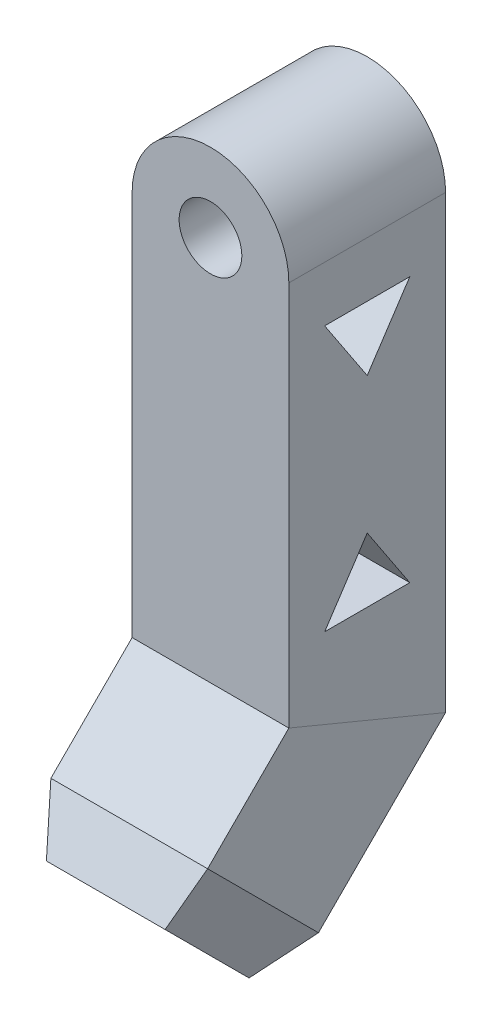
ISO-10303-21;
HEADER;
FILE_DESCRIPTION(('STEP AP214'),'2;1');
FILE_NAME('part.step','',(''),(''),'','','');
FILE_SCHEMA(('AUTOMOTIVE_DESIGN { 1 0 10303 214 1 1 1 1 }'));
ENDSEC;
DATA;
#1=APPLICATION_CONTEXT('core data for automotive mechanical design processes');
#2=APPLICATION_PROTOCOL_DEFINITION('international standard','automotive_design',2000,#1);
#3=PRODUCT_CONTEXT('',#1,'mechanical');
#4=PRODUCT('Part','Part','',(#3));
#5=PRODUCT_RELATED_PRODUCT_CATEGORY('part','',(#4));
#6=PRODUCT_DEFINITION_FORMATION('','',#4);
#7=PRODUCT_DEFINITION_CONTEXT('part definition',#1,'design');
#8=PRODUCT_DEFINITION('design','',#6,#7);
#9=PRODUCT_DEFINITION_SHAPE('','',#8);
#10=(LENGTH_UNIT() NAMED_UNIT(*) SI_UNIT(.MILLI.,.METRE.));
#11=(NAMED_UNIT(*) PLANE_ANGLE_UNIT() SI_UNIT($,.RADIAN.));
#12=(NAMED_UNIT(*) SI_UNIT($,.STERADIAN.) SOLID_ANGLE_UNIT());
#13=UNCERTAINTY_MEASURE_WITH_UNIT(LENGTH_MEASURE(1.E-05),#10,'distance_accuracy_value','');
#14=(GEOMETRIC_REPRESENTATION_CONTEXT(3) GLOBAL_UNCERTAINTY_ASSIGNED_CONTEXT((#13)) GLOBAL_UNIT_ASSIGNED_CONTEXT((#10,
#11,#12)) REPRESENTATION_CONTEXT('',''));
#15=CARTESIAN_POINT('',(0.,0.,0.));
#16=DIRECTION('',(0.,0.,1.));
#17=DIRECTION('',(1.,0.,0.));
#18=AXIS2_PLACEMENT_3D('',#15,#16,#17);
#19=CARTESIAN_POINT('',(19.05,14.4716722599583,7.26209610324911));
#20=DIRECTION('',(-1.,0.,0.));
#21=DIRECTION('',(0.,0.,1.));
#22=AXIS2_PLACEMENT_3D('',#19,#20,#21);
#23=PLANE('',#22);
#24=DIRECTION('',(0.,0.382683432365091,0.923879532511287));
#25=VECTOR('',#24,1.);
#26=CARTESIAN_POINT('',(19.05,16.4071676065253,52.1812165750785));
#27=LINE('',#26,#25);
#28=CARTESIAN_POINT('',(19.05,-13.0977683632075,-19.05));
#29=VERTEX_POINT('',#28);
#30=CARTESIAN_POINT('',(19.05,2.68376836320748,19.05));
#31=VERTEX_POINT('',#30);
#32=EDGE_CURVE('E278',#29,#31,#27,.T.);
#33=ORIENTED_EDGE('',*,*,#32,.T.);
#34=DIRECTION('',(0.,-0.707106781186546,0.707106781186549));
#35=VECTOR('',#34,1.);
#36=CARTESIAN_POINT('',(19.05,14.4716722599583,7.26209610324911));
#37=LINE('',#36,#35);
#38=CARTESIAN_POINT('',(19.05,-17.0609380798112,38.7947064430187));
#39=VERTEX_POINT('',#38);
#40=EDGE_CURVE('E49',#31,#39,#37,.T.);
#41=ORIENTED_EDGE('',*,*,#40,.T.);
#42=DIRECTION('',(0.,-0.707106781186549,-0.707106781186546));
#43=VECTOR('',#42,1.);
#44=CARTESIAN_POINT('',(19.05,-17.0609380798112,38.7947064430187));
#45=LINE('',#44,#43);
#46=CARTESIAN_POINT('',(19.05,-44.0017064430187,11.8539380798113));
#47=VERTEX_POINT('',#46);
#48=EDGE_CURVE('E317',#39,#47,#45,.T.);
#49=ORIENTED_EDGE('',*,*,#48,.T.);
#50=DIRECTION('',(0.,-0.707106781186546,0.707106781186549));
#51=VECTOR('',#50,1.);
#52=CARTESIAN_POINT('',(19.05,-12.4690961032492,-19.6786722599583));
#53=LINE('',#52,#51);
#54=EDGE_CURVE('E328',#29,#47,#53,.T.);
#55=ORIENTED_EDGE('',*,*,#54,.F.);
#56=EDGE_LOOP('',(#33,#41,#49,#55));
#57=FACE_BOUND('',#56,.T.);
#58=ADVANCED_FACE('F45',(#57),#23,.F.);
#59=CARTESIAN_POINT('',(-19.05,-12.4690961032492,-19.6786722599583));
#60=DIRECTION('',(0.,0.707106781186549,0.707106781186546));
#61=DIRECTION('',(0.,-0.707106781186546,0.707106781186549));
#62=AXIS2_PLACEMENT_3D('',#59,#60,#61);
#63=PLANE('',#62);
#64=DIRECTION('',(1.,0.,0.));
#65=VECTOR('',#64,1.);
#66=CARTESIAN_POINT('',(-19.05,-13.0977683632075,-19.05));
#67=LINE('',#66,#65);
#68=CARTESIAN_POINT('',(-19.05,-13.0977683632075,-19.05));
#69=VERTEX_POINT('',#68);
#70=EDGE_CURVE('E11',#69,#29,#67,.T.);
#71=ORIENTED_EDGE('',*,*,#70,.T.);
#72=ORIENTED_EDGE('',*,*,#54,.T.);
#73=DIRECTION('',(-1.,0.,0.));
#74=VECTOR('',#73,1.);
#75=CARTESIAN_POINT('',(-19.05,-44.0017064430187,11.8539380798113));
#76=LINE('',#75,#74);
#77=CARTESIAN_POINT('',(-19.05,-44.0017064430187,11.8539380798113));
#78=VERTEX_POINT('',#77);
#79=EDGE_CURVE('E313',#47,#78,#76,.T.);
#80=ORIENTED_EDGE('',*,*,#79,.T.);
#81=DIRECTION('',(0.,-0.707106781186546,0.707106781186549));
#82=VECTOR('',#81,1.);
#83=CARTESIAN_POINT('',(-19.05,-12.4690961032492,-19.6786722599583));
#84=LINE('',#83,#82);
#85=EDGE_CURVE('E325',#69,#78,#84,.T.);
#86=ORIENTED_EDGE('',*,*,#85,.F.);
#87=EDGE_LOOP('',(#71,#72,#80,#86));
#88=FACE_BOUND('',#87,.T.);
#89=ADVANCED_FACE('F356',(#88),#63,.F.);
#90=CARTESIAN_POINT('',(-19.05,14.4716722599583,7.26209610324911));
#91=DIRECTION('',(1.,0.,0.));
#92=DIRECTION('',(0.,0.,-1.));
#93=AXIS2_PLACEMENT_3D('',#90,#91,#92);
#94=PLANE('',#93);
#95=DIRECTION('',(0.,-0.382683432365091,-0.923879532511287));
#96=VECTOR('',#95,1.);
#97=CARTESIAN_POINT('',(-19.05,16.4071676065253,52.1812165750785));
#98=LINE('',#97,#96);
#99=CARTESIAN_POINT('',(-19.05,2.68376836320748,19.05));
#100=VERTEX_POINT('',#99);
#101=EDGE_CURVE('E55',#100,#69,#98,.T.);
#102=ORIENTED_EDGE('',*,*,#101,.T.);
#103=ORIENTED_EDGE('',*,*,#85,.T.);
#104=DIRECTION('',(0.,0.707106781186549,0.707106781186546));
#105=VECTOR('',#104,1.);
#106=CARTESIAN_POINT('',(-19.05,-17.0609380798112,38.7947064430187));
#107=LINE('',#106,#105);
#108=CARTESIAN_POINT('',(-19.05,-17.0609380798112,38.7947064430187));
#109=VERTEX_POINT('',#108);
#110=EDGE_CURVE('E309',#78,#109,#107,.T.);
#111=ORIENTED_EDGE('',*,*,#110,.T.);
#112=DIRECTION('',(0.,-0.707106781186546,0.707106781186549));
#113=VECTOR('',#112,1.);
#114=CARTESIAN_POINT('',(-19.05,14.4716722599583,7.26209610324911));
#115=LINE('',#114,#113);
#116=EDGE_CURVE('E321',#100,#109,#115,.T.);
#117=ORIENTED_EDGE('',*,*,#116,.F.);
#118=EDGE_LOOP('',(#102,#103,#111,#117));
#119=FACE_BOUND('',#118,.T.);
#120=ADVANCED_FACE('F347',(#119),#94,.F.);
#121=CARTESIAN_POINT('',(-19.05,14.4716722599583,7.26209610324911));
#122=DIRECTION('',(0.,-0.707106781186549,-0.707106781186546));
#123=DIRECTION('',(0.,0.707106781186546,-0.707106781186549));
#124=AXIS2_PLACEMENT_3D('',#121,#122,#123);
#125=PLANE('',#124);
#126=DIRECTION('',(-1.,0.,0.));
#127=VECTOR('',#126,1.);
#128=CARTESIAN_POINT('',(-19.05,2.68376836320748,19.05));
#129=LINE('',#128,#127);
#130=EDGE_CURVE('E274',#31,#100,#129,.T.);
#131=ORIENTED_EDGE('',*,*,#130,.T.);
#132=ORIENTED_EDGE('',*,*,#116,.T.);
#133=DIRECTION('',(1.,0.,0.));
#134=VECTOR('',#133,1.);
#135=CARTESIAN_POINT('',(-19.05,-17.0609380798112,38.7947064430187));
#136=LINE('',#135,#134);
#137=EDGE_CURVE('E247',#109,#39,#136,.T.);
#138=ORIENTED_EDGE('',*,*,#137,.T.);
#139=ORIENTED_EDGE('',*,*,#40,.F.);
#140=EDGE_LOOP('',(#131,#132,#138,#139));
#141=FACE_BOUND('',#140,.T.);
#142=ADVANCED_FACE('F47',(#141),#125,.F.);
#143=CARTESIAN_POINT('',(-19.05,96.393,19.05));
#144=DIRECTION('',(0.,0.,-1.));
#145=DIRECTION('',(0.,1.,0.));
#146=AXIS2_PLACEMENT_3D('',#143,#144,#145);
#147=PLANE('',#146);
#148=CARTESIAN_POINT('',(0.,96.393,19.05));
#149=DIRECTION('',(0.,0.,1.));
#150=DIRECTION('',(1.,0.,0.));
#151=AXIS2_PLACEMENT_3D('',#148,#149,#150);
#152=CIRCLE('',#151,7.62);
#153=CARTESIAN_POINT('',(7.62,96.393,19.05));
#154=VERTEX_POINT('',#153);
#155=EDGE_CURVE('E224',#154,#154,#152,.T.);
#156=ORIENTED_EDGE('',*,*,#155,.F.);
#157=EDGE_LOOP('',(#156));
#158=FACE_BOUND('',#157,.T.);
#159=DIRECTION('',(0.,-1.,0.));
#160=VECTOR('',#159,1.);
#161=CARTESIAN_POINT('',(19.05,96.393,19.05));
#162=LINE('',#161,#160);
#163=CARTESIAN_POINT('',(19.05,96.393,19.05));
#164=VERTEX_POINT('',#163);
#165=EDGE_CURVE('E289',#164,#31,#162,.T.);
#166=ORIENTED_EDGE('',*,*,#165,.F.);
#167=CARTESIAN_POINT('',(0.,96.393,19.05));
#168=DIRECTION('',(0.,0.,-1.));
#169=DIRECTION('',(0.,1.,0.));
#170=AXIS2_PLACEMENT_3D('',#167,#168,#169);
#171=CIRCLE('',#170,19.05);
#172=CARTESIAN_POINT('',(-19.05,96.393,19.05));
#173=VERTEX_POINT('',#172);
#174=EDGE_CURVE('E236',#164,#173,#171,.F.);
#175=ORIENTED_EDGE('',*,*,#174,.T.);
#176=DIRECTION('',(0.,-1.,0.));
#177=VECTOR('',#176,1.);
#178=CARTESIAN_POINT('',(-19.05,96.393,19.05));
#179=LINE('',#178,#177);
#180=EDGE_CURVE('E296',#173,#100,#179,.T.);
#181=ORIENTED_EDGE('',*,*,#180,.T.);
#182=ORIENTED_EDGE('',*,*,#130,.F.);
#183=EDGE_LOOP('',(#166,#175,#181,#182));
#184=FACE_BOUND('',#183,.T.);
#185=ADVANCED_FACE('F369',(#158,#184),#147,.F.);
#186=CARTESIAN_POINT('',(-19.05,96.393,19.05));
#187=DIRECTION('',(1.,0.,0.));
#188=DIRECTION('',(0.,0.,-1.));
#189=AXIS2_PLACEMENT_3D('',#186,#187,#188);
#190=PLANE('',#189);
#191=DIRECTION('',(0.,0.833779661271235,0.552097343274196));
#192=VECTOR('',#191,1.);
#193=CARTESIAN_POINT('',(-19.05,82.9999979899142,10.3451695250034));
#194=LINE('',#193,#192);
#195=CARTESIAN_POINT('',(-19.05,67.3766807480723,0.));
#196=VERTEX_POINT('',#195);
#197=CARTESIAN_POINT('',(-19.05,82.9999979899142,10.3451695250034));
#198=VERTEX_POINT('',#197);
#199=EDGE_CURVE('E174',#196,#198,#194,.T.);
#200=ORIENTED_EDGE('',*,*,#199,.F.);
#201=DIRECTION('',(0.,-0.833779661271235,0.552097343274195));
#202=VECTOR('',#201,1.);
#203=CARTESIAN_POINT('',(-19.05,82.9999979899142,-10.3451695250034));
#204=LINE('',#203,#202);
#205=CARTESIAN_POINT('',(-19.05,82.9999979899142,-10.3451695250034));
#206=VERTEX_POINT('',#205);
#207=EDGE_CURVE('E63',#206,#196,#204,.T.);
#208=ORIENTED_EDGE('',*,*,#207,.F.);
#209=DIRECTION('',(0.,0.,-1.));
#210=VECTOR('',#209,1.);
#211=CARTESIAN_POINT('',(-19.05,82.9999979899142,-10.3451695250034));
#212=LINE('',#211,#210);
#213=EDGE_CURVE('E170',#198,#206,#212,.T.);
#214=ORIENTED_EDGE('',*,*,#213,.F.);
#215=EDGE_LOOP('',(#200,#208,#214));
#216=FACE_BOUND('',#215,.T.);
#217=DIRECTION('',(0.,0.833779661271235,-0.552097343274196));
#218=VECTOR('',#217,1.);
#219=CARTESIAN_POINT('',(-19.05,18.6000020100858,10.3451695250034));
#220=LINE('',#219,#218);
#221=CARTESIAN_POINT('',(-19.05,18.6000020100858,10.3451695250034));
#222=VERTEX_POINT('',#221);
#223=CARTESIAN_POINT('',(-19.05,34.2233192519277,0.));
#224=VERTEX_POINT('',#223);
#225=EDGE_CURVE('E203',#222,#224,#220,.T.);
#226=ORIENTED_EDGE('',*,*,#225,.F.);
#227=DIRECTION('',(0.,0.,1.));
#228=VECTOR('',#227,1.);
#229=CARTESIAN_POINT('',(-19.05,18.6000020100858,-10.3451695250034));
#230=LINE('',#229,#228);
#231=CARTESIAN_POINT('',(-19.05,18.6000020100858,-10.3451695250034));
#232=VERTEX_POINT('',#231);
#233=EDGE_CURVE('E71',#232,#222,#230,.T.);
#234=ORIENTED_EDGE('',*,*,#233,.F.);
#235=DIRECTION('',(0.,-0.833779661271235,-0.552097343274195));
#236=VECTOR('',#235,1.);
#237=CARTESIAN_POINT('',(-19.05,18.6000020100858,-10.3451695250034));
#238=LINE('',#237,#236);
#239=EDGE_CURVE('E199',#224,#232,#238,.T.);
#240=ORIENTED_EDGE('',*,*,#239,.F.);
#241=EDGE_LOOP('',(#226,#234,#240));
#242=FACE_BOUND('',#241,.T.);
#243=ORIENTED_EDGE('',*,*,#180,.F.);
#244=DIRECTION('',(0.,0.,1.));
#245=VECTOR('',#244,1.);
#246=CARTESIAN_POINT('',(-19.05,96.393,19.05));
#247=LINE('',#246,#245);
#248=CARTESIAN_POINT('',(-19.05,96.393,-19.05));
#249=VERTEX_POINT('',#248);
#250=EDGE_CURVE('E283',#249,#173,#247,.T.);
#251=ORIENTED_EDGE('',*,*,#250,.F.);
#252=DIRECTION('',(0.,-1.,0.));
#253=VECTOR('',#252,1.);
#254=CARTESIAN_POINT('',(-19.05,96.393,-19.05));
#255=LINE('',#254,#253);
#256=EDGE_CURVE('E288',#249,#69,#255,.T.);
#257=ORIENTED_EDGE('',*,*,#256,.T.);
#258=ORIENTED_EDGE('',*,*,#101,.F.);
#259=EDGE_LOOP('',(#243,#251,#257,#258));
#260=FACE_BOUND('',#259,.T.);
#261=ADVANCED_FACE('F359',(#216,#242,#260),#190,.F.);
#262=CARTESIAN_POINT('',(-19.05,96.393,-19.05));
#263=DIRECTION('',(0.,0.,1.));
#264=DIRECTION('',(0.,-1.,0.));
#265=AXIS2_PLACEMENT_3D('',#262,#263,#264);
#266=PLANE('',#265);
#267=CARTESIAN_POINT('',(0.,96.393,-19.05));
#268=DIRECTION('',(0.,0.,1.));
#269=DIRECTION('',(1.,0.,0.));
#270=AXIS2_PLACEMENT_3D('',#267,#268,#269);
#271=CIRCLE('',#270,7.62);
#272=CARTESIAN_POINT('',(7.62,96.393,-19.05));
#273=VERTEX_POINT('',#272);
#274=EDGE_CURVE('E228',#273,#273,#271,.T.);
#275=ORIENTED_EDGE('',*,*,#274,.T.);
#276=EDGE_LOOP('',(#275));
#277=FACE_BOUND('',#276,.T.);
#278=ORIENTED_EDGE('',*,*,#256,.F.);
#279=CARTESIAN_POINT('',(0.,96.393,-19.05));
#280=DIRECTION('',(0.,0.,-1.));
#281=DIRECTION('',(0.,1.,0.));
#282=AXIS2_PLACEMENT_3D('',#279,#280,#281);
#283=CIRCLE('',#282,19.05);
#284=CARTESIAN_POINT('',(19.05,96.393,-19.05));
#285=VERTEX_POINT('',#284);
#286=EDGE_CURVE('E232',#249,#285,#283,.T.);
#287=ORIENTED_EDGE('',*,*,#286,.T.);
#288=DIRECTION('',(0.,-1.,0.));
#289=VECTOR('',#288,1.);
#290=CARTESIAN_POINT('',(19.05,96.393,-19.05));
#291=LINE('',#290,#289);
#292=EDGE_CURVE('E284',#285,#29,#291,.T.);
#293=ORIENTED_EDGE('',*,*,#292,.T.);
#294=ORIENTED_EDGE('',*,*,#70,.F.);
#295=EDGE_LOOP('',(#278,#287,#293,#294));
#296=FACE_BOUND('',#295,.T.);
#297=ADVANCED_FACE('F362',(#277,#296),#266,.F.);
#298=CARTESIAN_POINT('',(19.05,96.393,19.05));
#299=DIRECTION('',(-1.,0.,0.));
#300=DIRECTION('',(0.,0.,1.));
#301=AXIS2_PLACEMENT_3D('',#298,#299,#300);
#302=PLANE('',#301);
#303=DIRECTION('',(0.,0.,-1.));
#304=VECTOR('',#303,1.);
#305=CARTESIAN_POINT('',(19.05,82.9999979899142,-10.3451695250034));
#306=LINE('',#305,#304);
#307=CARTESIAN_POINT('',(19.05,82.9999979899142,10.3451695250034));
#308=VERTEX_POINT('',#307);
#309=CARTESIAN_POINT('',(19.05,82.9999979899142,-10.3451695250034));
#310=VERTEX_POINT('',#309);
#311=EDGE_CURVE('E158',#308,#310,#306,.T.);
#312=ORIENTED_EDGE('',*,*,#311,.T.);
#313=DIRECTION('',(0.,-0.833779661271235,0.552097343274195));
#314=VECTOR('',#313,1.);
#315=CARTESIAN_POINT('',(19.05,82.9999979899142,-10.3451695250034));
#316=LINE('',#315,#314);
#317=CARTESIAN_POINT('',(19.05,67.3766807480723,0.));
#318=VERTEX_POINT('',#317);
#319=EDGE_CURVE('E151',#310,#318,#316,.T.);
#320=ORIENTED_EDGE('',*,*,#319,.T.);
#321=DIRECTION('',(0.,0.833779661271235,0.552097343274196));
#322=VECTOR('',#321,1.);
#323=CARTESIAN_POINT('',(19.05,82.9999979899142,10.3451695250034));
#324=LINE('',#323,#322);
#325=EDGE_CURVE('E162',#318,#308,#324,.T.);
#326=ORIENTED_EDGE('',*,*,#325,.T.);
#327=EDGE_LOOP('',(#312,#320,#326));
#328=FACE_BOUND('',#327,.T.);
#329=DIRECTION('',(0.,-0.833779661271235,-0.552097343274195));
#330=VECTOR('',#329,1.);
#331=CARTESIAN_POINT('',(19.05,18.6000020100858,-10.3451695250034));
#332=LINE('',#331,#330);
#333=CARTESIAN_POINT('',(19.05,34.2233192519277,0.));
#334=VERTEX_POINT('',#333);
#335=CARTESIAN_POINT('',(19.05,18.6000020100858,-10.3451695250034));
#336=VERTEX_POINT('',#335);
#337=EDGE_CURVE('E192',#334,#336,#332,.T.);
#338=ORIENTED_EDGE('',*,*,#337,.T.);
#339=DIRECTION('',(0.,0.,1.));
#340=VECTOR('',#339,1.);
#341=CARTESIAN_POINT('',(19.05,18.6000020100858,-10.3451695250034));
#342=LINE('',#341,#340);
#343=CARTESIAN_POINT('',(19.05,18.6000020100858,10.3451695250034));
#344=VERTEX_POINT('',#343);
#345=EDGE_CURVE('E204',#336,#344,#342,.T.);
#346=ORIENTED_EDGE('',*,*,#345,.T.);
#347=DIRECTION('',(0.,0.833779661271235,-0.552097343274196));
#348=VECTOR('',#347,1.);
#349=CARTESIAN_POINT('',(19.05,18.6000020100858,10.3451695250034));
#350=LINE('',#349,#348);
#351=EDGE_CURVE('E213',#344,#334,#350,.T.);
#352=ORIENTED_EDGE('',*,*,#351,.T.);
#353=EDGE_LOOP('',(#338,#346,#352));
#354=FACE_BOUND('',#353,.T.);
#355=ORIENTED_EDGE('',*,*,#292,.F.);
#356=DIRECTION('',(0.,0.,-1.));
#357=VECTOR('',#356,1.);
#358=CARTESIAN_POINT('',(19.05,96.393,19.05));
#359=LINE('',#358,#357);
#360=EDGE_CURVE('E279',#164,#285,#359,.T.);
#361=ORIENTED_EDGE('',*,*,#360,.F.);
#362=ORIENTED_EDGE('',*,*,#165,.T.);
#363=ORIENTED_EDGE('',*,*,#32,.F.);
#364=EDGE_LOOP('',(#355,#361,#362,#363));
#365=FACE_BOUND('',#364,.T.);
#366=ADVANCED_FACE('F167',(#328,#354,#365),#302,.F.);
#367=CARTESIAN_POINT('',(19.05,-17.0609380798112,38.7947064430187));
#368=DIRECTION('',(0.,0.4226182617407,0.906307787036649));
#369=DIRECTION('',(0.,-0.90630778703665,0.4226182617407));
#370=AXIS2_PLACEMENT_3D('',#367,#368,#369);
#371=PLANE('',#370);
#372=ORIENTED_EDGE('',*,*,#137,.F.);
#373=DIRECTION('',(-0.323615577118185,0.857538139995739,-0.399876601840008));
#374=VECTOR('',#373,1.);
#375=CARTESIAN_POINT('',(-19.05,-17.0609380798112,38.7947064430187));
#376=LINE('',#375,#374);
#377=CARTESIAN_POINT('',(-14.4275780248192,-29.3097401250364,44.5064166399319));
#378=VERTEX_POINT('',#377);
#379=EDGE_CURVE('E244',#378,#109,#376,.T.);
#380=ORIENTED_EDGE('',*,*,#379,.F.);
#381=DIRECTION('',(1.,0.,0.));
#382=VECTOR('',#381,1.);
#383=CARTESIAN_POINT('',(19.05,-29.3097401250364,44.5064166399319));
#384=LINE('',#383,#382);
#385=CARTESIAN_POINT('',(14.4275780248192,-29.3097401250364,44.5064166399319));
#386=VERTEX_POINT('',#385);
#387=EDGE_CURVE('E240',#386,#378,#384,.F.);
#388=ORIENTED_EDGE('',*,*,#387,.F.);
#389=DIRECTION('',(0.323615577118185,0.857538139995739,-0.399876601840008));
#390=VECTOR('',#389,1.);
#391=CARTESIAN_POINT('',(19.05,-17.0609380798112,38.7947064430187));
#392=LINE('',#391,#390);
#393=EDGE_CURVE('E249',#386,#39,#392,.T.);
#394=ORIENTED_EDGE('',*,*,#393,.T.);
#395=EDGE_LOOP('',(#372,#380,#388,#394));
#396=FACE_BOUND('',#395,.T.);
#397=ADVANCED_FACE('F343',(#396),#371,.T.);
#398=CARTESIAN_POINT('',(-19.05,-17.0609380798112,38.7947064430187));
#399=DIRECTION('',(-0.939692620785908,-0.241844762647975,0.241844762647976));
#400=DIRECTION('',(0.249243569363955,0.,0.968440830991091));
#401=AXIS2_PLACEMENT_3D('',#398,#399,#400);
#402=PLANE('',#401);
#403=ORIENTED_EDGE('',*,*,#110,.F.);
#404=DIRECTION('',(-0.323615577118185,0.399876601840004,-0.857538139995741));
#405=VECTOR('',#404,1.);
#406=CARTESIAN_POINT('',(-19.05,-44.0017064430187,11.8539380798113));
#407=LINE('',#406,#405);
#408=CARTESIAN_POINT('',(-14.4275780248192,-49.7134166399318,24.1027401250365));
#409=VERTEX_POINT('',#408);
#410=EDGE_CURVE('E248',#409,#78,#407,.T.);
#411=ORIENTED_EDGE('',*,*,#410,.F.);
#412=DIRECTION('',(0.,0.707106781186549,0.707106781186546));
#413=VECTOR('',#412,1.);
#414=CARTESIAN_POINT('',(-14.4275780248192,-26.0411942008804,47.7749625640879));
#415=LINE('',#414,#413);
#416=EDGE_CURVE('E263',#378,#409,#415,.F.);
#417=ORIENTED_EDGE('',*,*,#416,.F.);
#418=ORIENTED_EDGE('',*,*,#379,.T.);
#419=EDGE_LOOP('',(#403,#411,#417,#418));
#420=FACE_BOUND('',#419,.T.);
#421=ADVANCED_FACE('F351',(#420),#402,.T.);
#422=CARTESIAN_POINT('',(-19.05,-44.0017064430187,11.8539380798113));
#423=DIRECTION('',(0.,-0.906307787036651,-0.422618261740697));
#424=DIRECTION('',(0.,0.422618261740697,-0.906307787036651));
#425=AXIS2_PLACEMENT_3D('',#422,#423,#424);
#426=PLANE('',#425);
#427=ORIENTED_EDGE('',*,*,#79,.F.);
#428=DIRECTION('',(0.323615577118185,0.399876601840004,-0.857538139995741));
#429=VECTOR('',#428,1.);
#430=CARTESIAN_POINT('',(19.05,-44.0017064430187,11.8539380798113));
#431=LINE('',#430,#429);
#432=CARTESIAN_POINT('',(14.4275780248192,-49.7134166399318,24.1027401250365));
#433=VERTEX_POINT('',#432);
#434=EDGE_CURVE('E252',#433,#47,#431,.T.);
#435=ORIENTED_EDGE('',*,*,#434,.F.);
#436=DIRECTION('',(-1.,0.,0.));
#437=VECTOR('',#436,1.);
#438=CARTESIAN_POINT('',(-19.05,-49.7134166399318,24.1027401250365));
#439=LINE('',#438,#437);
#440=EDGE_CURVE('E266',#409,#433,#439,.F.);
#441=ORIENTED_EDGE('',*,*,#440,.F.);
#442=ORIENTED_EDGE('',*,*,#410,.T.);
#443=EDGE_LOOP('',(#427,#435,#441,#442));
#444=FACE_BOUND('',#443,.T.);
#445=ADVANCED_FACE('F354',(#444),#426,.T.);
#446=CARTESIAN_POINT('',(19.05,-44.0017064430187,11.8539380798113));
#447=DIRECTION('',(0.939692620785908,-0.241844762647975,0.241844762647976));
#448=DIRECTION('',(0.249243569363955,0.,-0.968440830991091));
#449=AXIS2_PLACEMENT_3D('',#446,#447,#448);
#450=PLANE('',#449);
#451=ORIENTED_EDGE('',*,*,#48,.F.);
#452=ORIENTED_EDGE('',*,*,#393,.F.);
#453=DIRECTION('',(0.,-0.707106781186549,-0.707106781186546));
#454=VECTOR('',#453,1.);
#455=CARTESIAN_POINT('',(14.4275780248192,-52.9819625640879,20.8341942008805));
#456=LINE('',#455,#454);
#457=EDGE_CURVE('E253',#433,#386,#456,.F.);
#458=ORIENTED_EDGE('',*,*,#457,.F.);
#459=ORIENTED_EDGE('',*,*,#434,.T.);
#460=EDGE_LOOP('',(#451,#452,#458,#459));
#461=FACE_BOUND('',#460,.T.);
#462=ADVANCED_FACE('F397',(#461),#450,.T.);
#463=CARTESIAN_POINT('',(0.,-36.9080783824841,36.9080783824842));
#464=DIRECTION('',(0.,-0.707106781186546,0.707106781186549));
#465=DIRECTION('',(0.,-0.707106781186549,-0.707106781186546));
#466=AXIS2_PLACEMENT_3D('',#463,#464,#465);
#467=PLANE('',#466);
#468=CARTESIAN_POINT('',(0.,-39.5115783824841,34.3045783824842));
#469=DIRECTION('',(0.,-0.707106781186546,0.707106781186549));
#470=DIRECTION('',(0.,-0.707106781186549,-0.707106781186546));
#471=AXIS2_PLACEMENT_3D('',#468,#469,#470);
#472=CIRCLE('',#471,12.065);
#473=CARTESIAN_POINT('',(0.,-48.0428216974998,25.7733350674685));
#474=VERTEX_POINT('',#473);
#475=EDGE_CURVE('E186',#474,#474,#472,.T.);
#476=ORIENTED_EDGE('',*,*,#475,.F.);
#477=EDGE_LOOP('',(#476));
#478=FACE_BOUND('',#477,.T.);
#479=ORIENTED_EDGE('',*,*,#387,.T.);
#480=ORIENTED_EDGE('',*,*,#416,.T.);
#481=ORIENTED_EDGE('',*,*,#440,.T.);
#482=ORIENTED_EDGE('',*,*,#457,.T.);
#483=EDGE_LOOP('',(#479,#480,#481,#482));
#484=FACE_BOUND('',#483,.T.);
#485=ADVANCED_FACE('F399',(#478,#484),#467,.T.);
#486=CARTESIAN_POINT('',(0.,96.393,61.647094971371));
#487=DIRECTION('',(0.,0.,-1.));
#488=DIRECTION('',(0.,1.,0.));
#489=AXIS2_PLACEMENT_3D('',#486,#487,#488);
#490=CYLINDRICAL_SURFACE('',#489,19.05);
#491=ORIENTED_EDGE('',*,*,#174,.F.);
#492=ORIENTED_EDGE('',*,*,#360,.T.);
#493=ORIENTED_EDGE('',*,*,#286,.F.);
#494=ORIENTED_EDGE('',*,*,#250,.T.);
#495=EDGE_LOOP('',(#491,#492,#493,#494));
#496=FACE_BOUND('',#495,.T.);
#497=ADVANCED_FACE('F365',(#496),#490,.T.);
#498=CARTESIAN_POINT('',(0.,96.393,-19.05));
#499=DIRECTION('',(0.,0.,1.));
#500=DIRECTION('',(1.,0.,0.));
#501=AXIS2_PLACEMENT_3D('',#498,#499,#500);
#502=CYLINDRICAL_SURFACE('',#501,7.62);
#503=CARTESIAN_POINT('',(7.62,96.393,-19.05));
#504=CARTESIAN_POINT('',(7.62,96.393,-18.653125));
#505=CARTESIAN_POINT('',(7.62,96.393,-18.25625));
#506=CARTESIAN_POINT('',(7.62,96.393,-17.4625));
#507=CARTESIAN_POINT('',(7.62,96.393,-17.065625));
#508=CARTESIAN_POINT('',(7.62,96.393,-16.271875));
#509=CARTESIAN_POINT('',(7.62,96.393,-15.875));
#510=CARTESIAN_POINT('',(7.62,96.393,-15.08125));
#511=CARTESIAN_POINT('',(7.62,96.393,-14.684375));
#512=CARTESIAN_POINT('',(7.62,96.393,-13.890625));
#513=CARTESIAN_POINT('',(7.62,96.393,-13.49375));
#514=CARTESIAN_POINT('',(7.62,96.393,-12.7));
#515=CARTESIAN_POINT('',(7.62,96.393,-12.303125));
#516=CARTESIAN_POINT('',(7.62,96.393,-11.509375));
#517=CARTESIAN_POINT('',(7.62,96.393,-11.1125));
#518=CARTESIAN_POINT('',(7.62,96.393,-10.31875));
#519=CARTESIAN_POINT('',(7.62,96.393,-9.92187500000001));
#520=CARTESIAN_POINT('',(7.62,96.393,-9.12812500000001));
#521=CARTESIAN_POINT('',(7.62,96.393,-8.73125000000001));
#522=CARTESIAN_POINT('',(7.62,96.393,-7.93750000000001));
#523=CARTESIAN_POINT('',(7.62,96.393,-7.54062500000001));
#524=CARTESIAN_POINT('',(7.62,96.393,-6.74687500000001));
#525=CARTESIAN_POINT('',(7.62,96.393,-6.35000000000001));
#526=CARTESIAN_POINT('',(7.62,96.393,-5.55625000000001));
#527=CARTESIAN_POINT('',(7.62,96.393,-5.15937500000001));
#528=CARTESIAN_POINT('',(7.62,96.393,-4.36562500000001));
#529=CARTESIAN_POINT('',(7.62,96.393,-3.96875000000001));
#530=CARTESIAN_POINT('',(7.62,96.393,-3.17500000000001));
#531=CARTESIAN_POINT('',(7.62,96.393,-2.77812500000001));
#532=CARTESIAN_POINT('',(7.62,96.393,-1.98437500000001));
#533=CARTESIAN_POINT('',(7.62,96.393,-1.58750000000001));
#534=CARTESIAN_POINT('',(7.62,96.393,-0.793750000000011));
#535=CARTESIAN_POINT('',(7.62,96.393,-0.396875000000011));
#536=CARTESIAN_POINT('',(7.62,96.393,0.39687499999999));
#537=CARTESIAN_POINT('',(7.62,96.393,0.79374999999999));
#538=CARTESIAN_POINT('',(7.62,96.393,1.58749999999999));
#539=CARTESIAN_POINT('',(7.62,96.393,1.98437499999999));
#540=CARTESIAN_POINT('',(7.62,96.393,2.77812499999999));
#541=CARTESIAN_POINT('',(7.62,96.393,3.17499999999999));
#542=CARTESIAN_POINT('',(7.62,96.393,3.96874999999999));
#543=CARTESIAN_POINT('',(7.62,96.393,4.36562499999999));
#544=CARTESIAN_POINT('',(7.62,96.393,5.15937499999999));
#545=CARTESIAN_POINT('',(7.62,96.393,5.55624999999999));
#546=CARTESIAN_POINT('',(7.62,96.393,6.34999999999999));
#547=CARTESIAN_POINT('',(7.62,96.393,6.74687499999999));
#548=CARTESIAN_POINT('',(7.62,96.393,7.54062499999999));
#549=CARTESIAN_POINT('',(7.62,96.393,7.93749999999999));
#550=CARTESIAN_POINT('',(7.62,96.393,8.73124999999999));
#551=CARTESIAN_POINT('',(7.62,96.393,9.12812499999999));
#552=CARTESIAN_POINT('',(7.62,96.393,9.92187499999999));
#553=CARTESIAN_POINT('',(7.62,96.393,10.31875));
#554=CARTESIAN_POINT('',(7.62,96.393,11.1125));
#555=CARTESIAN_POINT('',(7.62,96.393,11.509375));
#556=CARTESIAN_POINT('',(7.62,96.393,12.303125));
#557=CARTESIAN_POINT('',(7.62,96.393,12.7));
#558=CARTESIAN_POINT('',(7.62,96.393,13.49375));
#559=CARTESIAN_POINT('',(7.62,96.393,13.890625));
#560=CARTESIAN_POINT('',(7.62,96.393,14.684375));
#561=CARTESIAN_POINT('',(7.62,96.393,15.08125));
#562=CARTESIAN_POINT('',(7.62,96.393,15.875));
#563=CARTESIAN_POINT('',(7.62,96.393,16.271875));
#564=CARTESIAN_POINT('',(7.62,96.393,17.065625));
#565=CARTESIAN_POINT('',(7.62,96.393,17.4625));
#566=CARTESIAN_POINT('',(7.62,96.393,18.25625));
#567=CARTESIAN_POINT('',(7.62,96.393,18.653125));
#568=CARTESIAN_POINT('',(7.62,96.393,19.05));
#569=B_SPLINE_CURVE_WITH_KNOTS('',3,(#503,#504,#505,#506,#507,#508,#509,#510,#511,#512,#513,
#514,#515,#516,#517,#518,#519,#520,#521,#522,#523,#524,#525,#526,#527,#528,#529,#530,#531,#532,
#533,#534,#535,#536,#537,#538,#539,#540,#541,#542,#543,#544,#545,#546,#547,#548,#549,#550,#551,
#552,#553,#554,#555,#556,#557,#558,#559,#560,#561,#562,#563,#564,#565,#566,#567,#568),
.UNSPECIFIED.,.F.,.F.,(4,2,2,2,2,2,2,2,2,2,2,2,2,2,2,2,2,2,2,2,2,2,2,2,2,2,2,2,2,2,2,2,4),(0.,
1.190625,2.38125,3.571875,4.7625,5.953125,7.14375,8.334375,9.525,10.715625,11.90625,13.096875,
14.2875,15.478125,16.66875,17.859375,19.05,20.240625,21.43125,22.621875,23.8125,25.003125,
26.19375,27.384375,28.575,29.765625,30.95625,32.146875,33.3375,34.528125,35.71875,36.909375,
38.1),.UNSPECIFIED.);
#570=EDGE_CURVE('BSEAM406',#273,#154,#569,.T.);
#571=ORIENTED_EDGE('',*,*,#274,.F.);
#572=ORIENTED_EDGE('',*,*,#155,.T.);
#573=ORIENTED_EDGE('',*,*,#570,.T.);
#574=ORIENTED_EDGE('',*,*,#570,.F.);
#575=EDGE_LOOP('',(#571,#573,#572,#574));
#576=FACE_BOUND('',#575,.T.);
#577=ADVANCED_FACE('F406',(#576),#502,.F.);
#578=CARTESIAN_POINT('',(0.,-30.531322261415,25.324322261415));
#579=DIRECTION('',(0.,-0.707106781186546,0.707106781186549));
#580=DIRECTION('',(0.,-0.707106781186549,-0.707106781186546));
#581=AXIS2_PLACEMENT_3D('',#578,#579,#580);
#582=CYLINDRICAL_SURFACE('',#581,12.065);
#583=CARTESIAN_POINT('',(0.,-30.531322261415,25.324322261415));
#584=DIRECTION('',(0.,-0.707106781186546,0.707106781186549));
#585=DIRECTION('',(0.,-0.707106781186549,-0.707106781186546));
#586=AXIS2_PLACEMENT_3D('',#583,#584,#585);
#587=CIRCLE('',#586,12.065);
#588=CARTESIAN_POINT('',(0.,-39.0625655764307,16.7930789463994));
#589=VERTEX_POINT('',#588);
#590=EDGE_CURVE('E220',#589,#589,#587,.T.);
#591=ORIENTED_EDGE('',*,*,#590,.F.);
#592=EDGE_LOOP('',(#591));
#593=FACE_BOUND('',#592,.T.);
#594=ORIENTED_EDGE('',*,*,#475,.T.);
#595=EDGE_LOOP('',(#594));
#596=FACE_BOUND('',#595,.T.);
#597=ADVANCED_FACE('F409',(#593,#596),#582,.F.);
#598=CARTESIAN_POINT('',(0.,-30.531322261415,25.324322261415));
#599=DIRECTION('',(0.,-0.707106781186546,0.707106781186549));
#600=DIRECTION('',(0.,-0.707106781186549,-0.707106781186546));
#601=AXIS2_PLACEMENT_3D('',#598,#599,#600);
#602=PLANE('',#601);
#603=ORIENTED_EDGE('',*,*,#590,.T.);
#604=EDGE_LOOP('',(#603));
#605=FACE_BOUND('',#604,.T.);
#606=ADVANCED_FACE('F413',(#605),#602,.T.);
#607=CARTESIAN_POINT('',(19.05,18.6000020100858,-10.3451695250034));
#608=DIRECTION('',(0.,-1.,0.));
#609=DIRECTION('',(0.,0.,-1.));
#610=AXIS2_PLACEMENT_3D('',#607,#608,#609);
#611=PLANE('',#610);
#612=ORIENTED_EDGE('',*,*,#233,.T.);
#613=DIRECTION('',(-1.,0.,0.));
#614=VECTOR('',#613,1.);
#615=CARTESIAN_POINT('',(19.05,18.6000020100858,10.3451695250034));
#616=LINE('',#615,#614);
#617=EDGE_CURVE('E189',#344,#222,#616,.T.);
#618=ORIENTED_EDGE('',*,*,#617,.F.);
#619=ORIENTED_EDGE('',*,*,#345,.F.);
#620=DIRECTION('',(-1.,0.,0.));
#621=VECTOR('',#620,1.);
#622=CARTESIAN_POINT('',(19.05,18.6000020100858,-10.3451695250034));
#623=LINE('',#622,#621);
#624=EDGE_CURVE('E196',#336,#232,#623,.T.);
#625=ORIENTED_EDGE('',*,*,#624,.T.);
#626=EDGE_LOOP('',(#612,#618,#619,#625));
#627=FACE_BOUND('',#626,.T.);
#628=ADVANCED_FACE('F417',(#627),#611,.F.);
#629=CARTESIAN_POINT('',(19.05,18.6000020100858,-10.3451695250034));
#630=DIRECTION('',(0.,0.552097343274195,-0.833779661271235));
#631=DIRECTION('',(0.,0.833779661271235,0.552097343274195));
#632=AXIS2_PLACEMENT_3D('',#629,#630,#631);
#633=PLANE('',#632);
#634=ORIENTED_EDGE('',*,*,#239,.T.);
#635=ORIENTED_EDGE('',*,*,#624,.F.);
#636=ORIENTED_EDGE('',*,*,#337,.F.);
#637=DIRECTION('',(-1.,0.,0.));
#638=VECTOR('',#637,1.);
#639=CARTESIAN_POINT('',(19.05,34.2233192519277,0.));
#640=LINE('',#639,#638);
#641=EDGE_CURVE('E193',#334,#224,#640,.T.);
#642=ORIENTED_EDGE('',*,*,#641,.T.);
#643=EDGE_LOOP('',(#634,#635,#636,#642));
#644=FACE_BOUND('',#643,.T.);
#645=ADVANCED_FACE('F419',(#644),#633,.F.);
#646=CARTESIAN_POINT('',(19.05,18.6000020100858,10.3451695250034));
#647=DIRECTION('',(0.,0.552097343274196,0.833779661271235));
#648=DIRECTION('',(0.,-0.833779661271235,0.552097343274196));
#649=AXIS2_PLACEMENT_3D('',#646,#647,#648);
#650=PLANE('',#649);
#651=ORIENTED_EDGE('',*,*,#225,.T.);
#652=ORIENTED_EDGE('',*,*,#641,.F.);
#653=ORIENTED_EDGE('',*,*,#351,.F.);
#654=ORIENTED_EDGE('',*,*,#617,.T.);
#655=EDGE_LOOP('',(#651,#652,#653,#654));
#656=FACE_BOUND('',#655,.T.);
#657=ADVANCED_FACE('F422',(#656),#650,.F.);
#658=CARTESIAN_POINT('',(19.05,82.9999979899142,-10.3451695250034));
#659=DIRECTION('',(0.,-0.552097343274195,-0.833779661271235));
#660=DIRECTION('',(0.,0.833779661271235,-0.552097343274195));
#661=AXIS2_PLACEMENT_3D('',#658,#659,#660);
#662=PLANE('',#661);
#663=ORIENTED_EDGE('',*,*,#207,.T.);
#664=DIRECTION('',(-1.,0.,0.));
#665=VECTOR('',#664,1.);
#666=CARTESIAN_POINT('',(19.05,67.3766807480723,0.));
#667=LINE('',#666,#665);
#668=EDGE_CURVE('E147',#318,#196,#667,.T.);
#669=ORIENTED_EDGE('',*,*,#668,.F.);
#670=ORIENTED_EDGE('',*,*,#319,.F.);
#671=DIRECTION('',(-1.,0.,0.));
#672=VECTOR('',#671,1.);
#673=CARTESIAN_POINT('',(19.05,82.9999979899142,-10.3451695250034));
#674=LINE('',#673,#672);
#675=EDGE_CURVE('E183',#310,#206,#674,.T.);
#676=ORIENTED_EDGE('',*,*,#675,.T.);
#677=EDGE_LOOP('',(#663,#669,#670,#676));
#678=FACE_BOUND('',#677,.T.);
#679=ADVANCED_FACE('F149',(#678),#662,.F.);
#680=CARTESIAN_POINT('',(19.05,82.9999979899142,-10.3451695250034));
#681=DIRECTION('',(0.,1.,0.));
#682=DIRECTION('',(0.,0.,1.));
#683=AXIS2_PLACEMENT_3D('',#680,#681,#682);
#684=PLANE('',#683);
#685=ORIENTED_EDGE('',*,*,#213,.T.);
#686=ORIENTED_EDGE('',*,*,#675,.F.);
#687=ORIENTED_EDGE('',*,*,#311,.F.);
#688=DIRECTION('',(-1.,0.,0.));
#689=VECTOR('',#688,1.);
#690=CARTESIAN_POINT('',(19.05,82.9999979899142,10.3451695250034));
#691=LINE('',#690,#689);
#692=EDGE_CURVE('E157',#308,#198,#691,.T.);
#693=ORIENTED_EDGE('',*,*,#692,.T.);
#694=EDGE_LOOP('',(#685,#686,#687,#693));
#695=FACE_BOUND('',#694,.T.);
#696=ADVANCED_FACE('F430',(#695),#684,.F.);
#697=CARTESIAN_POINT('',(19.05,82.9999979899142,10.3451695250034));
#698=DIRECTION('',(0.,-0.552097343274196,0.833779661271235));
#699=DIRECTION('',(0.,-0.833779661271235,-0.552097343274196));
#700=AXIS2_PLACEMENT_3D('',#697,#698,#699);
#701=PLANE('',#700);
#702=ORIENTED_EDGE('',*,*,#199,.T.);
#703=ORIENTED_EDGE('',*,*,#692,.F.);
#704=ORIENTED_EDGE('',*,*,#325,.F.);
#705=ORIENTED_EDGE('',*,*,#668,.T.);
#706=EDGE_LOOP('',(#702,#703,#704,#705));
#707=FACE_BOUND('',#706,.T.);
#708=ADVANCED_FACE('F163',(#707),#701,.F.);
#709=CLOSED_SHELL('',(#58,#89,#120,#142,#185,#261,#297,#366,#397,#421,#445,#462,#485,#497,#577,
#597,#606,#628,#645,#657,#679,#696,#708));
#710=MANIFOLD_SOLID_BREP('B2',#709);
#711=ADVANCED_BREP_SHAPE_REPRESENTATION('',(#18,#710),#14);
#712=SHAPE_DEFINITION_REPRESENTATION(#9,#711);
ENDSEC;
END-ISO-10303-21;
